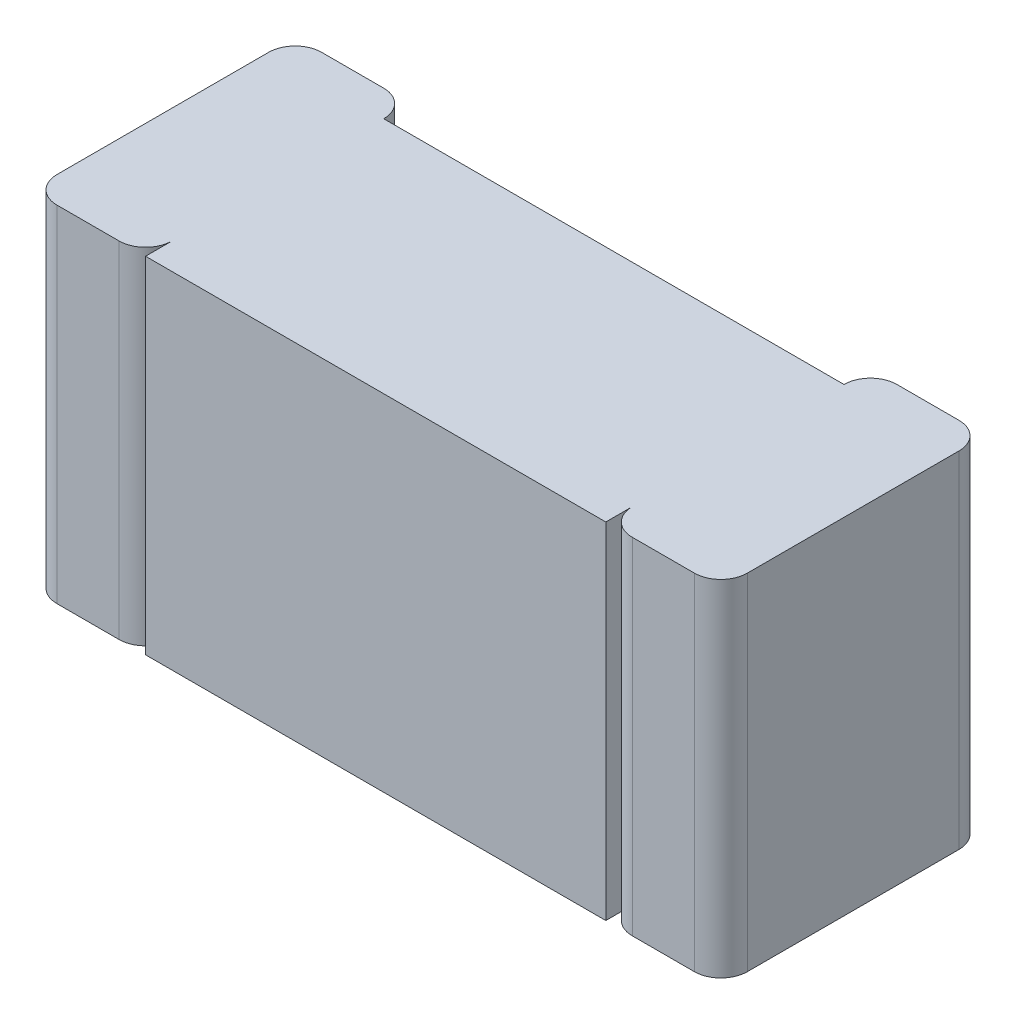
ISO-10303-21;
HEADER;
FILE_DESCRIPTION(('STEP AP214'),'2;1');
FILE_NAME('part.step','',(''),(''),'','','');
FILE_SCHEMA(('AUTOMOTIVE_DESIGN { 1 0 10303 214 1 1 1 1 }'));
ENDSEC;
DATA;
#1=APPLICATION_CONTEXT('core data for automotive mechanical design processes');
#2=APPLICATION_PROTOCOL_DEFINITION('international standard','automotive_design',2000,#1);
#3=PRODUCT_CONTEXT('',#1,'mechanical');
#4=PRODUCT('Part','Part','',(#3));
#5=PRODUCT_RELATED_PRODUCT_CATEGORY('part','',(#4));
#6=PRODUCT_DEFINITION_FORMATION('','',#4);
#7=PRODUCT_DEFINITION_CONTEXT('part definition',#1,'design');
#8=PRODUCT_DEFINITION('design','',#6,#7);
#9=PRODUCT_DEFINITION_SHAPE('','',#8);
#10=(LENGTH_UNIT() NAMED_UNIT(*) SI_UNIT(.MILLI.,.METRE.));
#11=(NAMED_UNIT(*) PLANE_ANGLE_UNIT() SI_UNIT($,.RADIAN.));
#12=(NAMED_UNIT(*) SI_UNIT($,.STERADIAN.) SOLID_ANGLE_UNIT());
#13=UNCERTAINTY_MEASURE_WITH_UNIT(LENGTH_MEASURE(1.E-05),#10,'distance_accuracy_value','');
#14=(GEOMETRIC_REPRESENTATION_CONTEXT(3) GLOBAL_UNCERTAINTY_ASSIGNED_CONTEXT((#13)) GLOBAL_UNIT_ASSIGNED_CONTEXT((#10,
#11,#12)) REPRESENTATION_CONTEXT('',''));
#15=CARTESIAN_POINT('',(0.,0.,0.));
#16=DIRECTION('',(0.,0.,1.));
#17=DIRECTION('',(1.,0.,0.));
#18=AXIS2_PLACEMENT_3D('',#15,#16,#17);
#19=CARTESIAN_POINT('',(-0.277,-0.15,0.023));
#20=DIRECTION('',(0.,1.,0.));
#21=DIRECTION('',(0.,0.,1.));
#22=AXIS2_PLACEMENT_3D('',#19,#20,#21);
#23=CYLINDRICAL_SURFACE('',#22,0.0230000000000008);
#24=DIRECTION('',(0.,-1.,0.));
#25=VECTOR('',#24,1.);
#26=CARTESIAN_POINT('',(-0.277,0.,0.));
#27=LINE('',#26,#25);
#28=CARTESIAN_POINT('',(-0.277,0.15,0.));
#29=VERTEX_POINT('',#28);
#30=CARTESIAN_POINT('',(-0.277,-0.15,0.));
#31=VERTEX_POINT('',#30);
#32=EDGE_CURVE('E127',#29,#31,#27,.T.);
#33=ORIENTED_EDGE('',*,*,#32,.T.);
#34=CARTESIAN_POINT('',(-0.277,-0.15,0.023));
#35=DIRECTION('',(0.,1.,0.));
#36=DIRECTION('',(0.,0.,1.));
#37=AXIS2_PLACEMENT_3D('',#34,#35,#36);
#38=CIRCLE('',#37,0.0230000000000008);
#39=CARTESIAN_POINT('',(-0.3,-0.15,0.023));
#40=VERTEX_POINT('',#39);
#41=EDGE_CURVE('E20',#31,#40,#38,.T.);
#42=ORIENTED_EDGE('',*,*,#41,.T.);
#43=DIRECTION('',(0.,1.,0.));
#44=VECTOR('',#43,1.);
#45=CARTESIAN_POINT('',(-0.3,0.,0.023));
#46=LINE('',#45,#44);
#47=CARTESIAN_POINT('',(-0.3,0.15,0.023));
#48=VERTEX_POINT('',#47);
#49=EDGE_CURVE('E137',#40,#48,#46,.T.);
#50=ORIENTED_EDGE('',*,*,#49,.T.);
#51=CARTESIAN_POINT('',(-0.277,0.15,0.023));
#52=DIRECTION('',(0.,1.,0.));
#53=DIRECTION('',(0.,0.,1.));
#54=AXIS2_PLACEMENT_3D('',#51,#52,#53);
#55=CIRCLE('',#54,0.0230000000000008);
#56=EDGE_CURVE('E235',#29,#48,#55,.T.);
#57=ORIENTED_EDGE('',*,*,#56,.F.);
#58=EDGE_LOOP('',(#33,#42,#50,#57));
#59=FACE_BOUND('',#58,.T.);
#60=ADVANCED_FACE('F16',(#59),#23,.T.);
#61=CARTESIAN_POINT('',(-0.3,0.15,0.023));
#62=DIRECTION('',(1.,0.,0.));
#63=DIRECTION('',(0.,0.,1.));
#64=AXIS2_PLACEMENT_3D('',#61,#62,#63);
#65=PLANE('',#64);
#66=DIRECTION('',(0.,0.,1.));
#67=VECTOR('',#66,1.);
#68=CARTESIAN_POINT('',(-0.3,0.15,0.115));
#69=LINE('',#68,#67);
#70=CARTESIAN_POINT('',(-0.3,0.15,0.207));
#71=VERTEX_POINT('',#70);
#72=EDGE_CURVE('E143',#48,#71,#69,.T.);
#73=ORIENTED_EDGE('',*,*,#72,.F.);
#74=ORIENTED_EDGE('',*,*,#49,.F.);
#75=DIRECTION('',(0.,0.,1.));
#76=VECTOR('',#75,1.);
#77=CARTESIAN_POINT('',(-0.3,-0.15,0.115));
#78=LINE('',#77,#76);
#79=CARTESIAN_POINT('',(-0.3,-0.15,0.207));
#80=VERTEX_POINT('',#79);
#81=EDGE_CURVE('E138',#40,#80,#78,.T.);
#82=ORIENTED_EDGE('',*,*,#81,.T.);
#83=DIRECTION('',(0.,-1.,0.));
#84=VECTOR('',#83,1.);
#85=CARTESIAN_POINT('',(-0.3,0.,0.207));
#86=LINE('',#85,#84);
#87=EDGE_CURVE('E142',#71,#80,#86,.T.);
#88=ORIENTED_EDGE('',*,*,#87,.F.);
#89=EDGE_LOOP('',(#73,#74,#82,#88));
#90=FACE_BOUND('',#89,.T.);
#91=ADVANCED_FACE('F139',(#90),#65,.F.);
#92=CARTESIAN_POINT('',(-0.277,-0.15,0.207));
#93=DIRECTION('',(0.,1.,0.));
#94=DIRECTION('',(0.,0.,1.));
#95=AXIS2_PLACEMENT_3D('',#92,#93,#94);
#96=CYLINDRICAL_SURFACE('',#95,0.0230000000000008);
#97=CARTESIAN_POINT('',(-0.277,0.15,0.207));
#98=DIRECTION('',(0.,1.,0.));
#99=DIRECTION('',(0.,0.,1.));
#100=AXIS2_PLACEMENT_3D('',#97,#98,#99);
#101=CIRCLE('',#100,0.0230000000000008);
#102=CARTESIAN_POINT('',(-0.277,0.15,0.23));
#103=VERTEX_POINT('',#102);
#104=EDGE_CURVE('E230',#71,#103,#101,.T.);
#105=ORIENTED_EDGE('',*,*,#104,.F.);
#106=ORIENTED_EDGE('',*,*,#87,.T.);
#107=CARTESIAN_POINT('',(-0.277,-0.15,0.207));
#108=DIRECTION('',(0.,1.,0.));
#109=DIRECTION('',(0.,0.,1.));
#110=AXIS2_PLACEMENT_3D('',#107,#108,#109);
#111=CIRCLE('',#110,0.0230000000000008);
#112=CARTESIAN_POINT('',(-0.277,-0.15,0.23));
#113=VERTEX_POINT('',#112);
#114=EDGE_CURVE('E151',#80,#113,#111,.T.);
#115=ORIENTED_EDGE('',*,*,#114,.T.);
#116=DIRECTION('',(0.,-1.,0.));
#117=VECTOR('',#116,1.);
#118=CARTESIAN_POINT('',(-0.277,0.,0.23));
#119=LINE('',#118,#117);
#120=EDGE_CURVE('E199',#103,#113,#119,.T.);
#121=ORIENTED_EDGE('',*,*,#120,.F.);
#122=EDGE_LOOP('',(#105,#106,#115,#121));
#123=FACE_BOUND('',#122,.T.);
#124=ADVANCED_FACE('F478',(#123),#96,.T.);
#125=CARTESIAN_POINT('',(-0.277,-0.15,0.23));
#126=DIRECTION('',(0.,0.,1.));
#127=DIRECTION('',(1.,0.,0.));
#128=AXIS2_PLACEMENT_3D('',#125,#126,#127);
#129=PLANE('',#128);
#130=DIRECTION('',(1.,0.,0.));
#131=VECTOR('',#130,1.);
#132=CARTESIAN_POINT('',(-0.25,-0.15,0.23));
#133=LINE('',#132,#131);
#134=CARTESIAN_POINT('',(-0.223,-0.15,0.23));
#135=VERTEX_POINT('',#134);
#136=EDGE_CURVE('E249',#113,#135,#133,.T.);
#137=ORIENTED_EDGE('',*,*,#136,.T.);
#138=DIRECTION('',(0.,-1.,0.));
#139=VECTOR('',#138,1.);
#140=CARTESIAN_POINT('',(-0.223,0.,0.23));
#141=LINE('',#140,#139);
#142=CARTESIAN_POINT('',(-0.223,0.15,0.23));
#143=VERTEX_POINT('',#142);
#144=EDGE_CURVE('E196',#143,#135,#141,.T.);
#145=ORIENTED_EDGE('',*,*,#144,.F.);
#146=DIRECTION('',(1.,0.,0.));
#147=VECTOR('',#146,1.);
#148=CARTESIAN_POINT('',(-0.25,0.15,0.23));
#149=LINE('',#148,#147);
#150=EDGE_CURVE('E228',#103,#143,#149,.T.);
#151=ORIENTED_EDGE('',*,*,#150,.F.);
#152=ORIENTED_EDGE('',*,*,#120,.T.);
#153=EDGE_LOOP('',(#137,#145,#151,#152));
#154=FACE_BOUND('',#153,.T.);
#155=ADVANCED_FACE('F467',(#154),#129,.T.);
#156=CARTESIAN_POINT('',(-0.223,-0.15,0.207));
#157=DIRECTION('',(0.,1.,0.));
#158=DIRECTION('',(0.,0.,1.));
#159=AXIS2_PLACEMENT_3D('',#156,#157,#158);
#160=CYLINDRICAL_SURFACE('',#159,0.0230000000000009);
#161=ORIENTED_EDGE('',*,*,#144,.T.);
#162=CARTESIAN_POINT('',(-0.223,-0.15,0.207));
#163=DIRECTION('',(0.,1.,0.));
#164=DIRECTION('',(0.,0.,1.));
#165=AXIS2_PLACEMENT_3D('',#162,#163,#164);
#166=CIRCLE('',#165,0.0230000000000009);
#167=CARTESIAN_POINT('',(-0.2,-0.15,0.207));
#168=VERTEX_POINT('',#167);
#169=EDGE_CURVE('E247',#135,#168,#166,.T.);
#170=ORIENTED_EDGE('',*,*,#169,.T.);
#171=DIRECTION('',(0.,1.,0.));
#172=VECTOR('',#171,1.);
#173=CARTESIAN_POINT('',(-0.2,0.,0.207));
#174=LINE('',#173,#172);
#175=CARTESIAN_POINT('',(-0.2,0.15,0.207));
#176=VERTEX_POINT('',#175);
#177=EDGE_CURVE('E194',#168,#176,#174,.T.);
#178=ORIENTED_EDGE('',*,*,#177,.T.);
#179=CARTESIAN_POINT('',(-0.223,0.15,0.207));
#180=DIRECTION('',(0.,1.,0.));
#181=DIRECTION('',(0.,0.,1.));
#182=AXIS2_PLACEMENT_3D('',#179,#180,#181);
#183=CIRCLE('',#182,0.0230000000000009);
#184=EDGE_CURVE('E227',#143,#176,#183,.T.);
#185=ORIENTED_EDGE('',*,*,#184,.F.);
#186=EDGE_LOOP('',(#161,#170,#178,#185));
#187=FACE_BOUND('',#186,.T.);
#188=ADVANCED_FACE('F453',(#187),#160,.T.);
#189=CARTESIAN_POINT('',(-0.2,0.15,0.207));
#190=DIRECTION('',(1.,0.,0.));
#191=DIRECTION('',(0.,0.,1.));
#192=AXIS2_PLACEMENT_3D('',#189,#190,#191);
#193=PLANE('',#192);
#194=DIRECTION('',(0.,0.,1.));
#195=VECTOR('',#194,1.);
#196=CARTESIAN_POINT('',(-0.2,0.15,0.2185));
#197=LINE('',#196,#195);
#198=CARTESIAN_POINT('',(-0.2,0.15,0.23));
#199=VERTEX_POINT('',#198);
#200=EDGE_CURVE('E187',#176,#199,#197,.T.);
#201=ORIENTED_EDGE('',*,*,#200,.F.);
#202=ORIENTED_EDGE('',*,*,#177,.F.);
#203=DIRECTION('',(0.,0.,1.));
#204=VECTOR('',#203,1.);
#205=CARTESIAN_POINT('',(-0.2,-0.15,0.2185));
#206=LINE('',#205,#204);
#207=CARTESIAN_POINT('',(-0.2,-0.15,0.23));
#208=VERTEX_POINT('',#207);
#209=EDGE_CURVE('E206',#168,#208,#206,.T.);
#210=ORIENTED_EDGE('',*,*,#209,.T.);
#211=DIRECTION('',(0.,-1.,0.));
#212=VECTOR('',#211,1.);
#213=CARTESIAN_POINT('',(-0.2,0.,0.23));
#214=LINE('',#213,#212);
#215=EDGE_CURVE('E185',#199,#208,#214,.T.);
#216=ORIENTED_EDGE('',*,*,#215,.F.);
#217=EDGE_LOOP('',(#201,#202,#210,#216));
#218=FACE_BOUND('',#217,.T.);
#219=ADVANCED_FACE('F445',(#218),#193,.F.);
#220=CARTESIAN_POINT('',(-0.2,-0.15,0.23));
#221=DIRECTION('',(0.,0.,1.));
#222=DIRECTION('',(1.,0.,0.));
#223=AXIS2_PLACEMENT_3D('',#220,#221,#222);
#224=PLANE('',#223);
#225=DIRECTION('',(0.,-1.,0.));
#226=VECTOR('',#225,1.);
#227=CARTESIAN_POINT('',(0.2,0.,0.23));
#228=LINE('',#227,#226);
#229=CARTESIAN_POINT('',(0.2,0.15,0.23));
#230=VERTEX_POINT('',#229);
#231=CARTESIAN_POINT('',(0.2,-0.15,0.23));
#232=VERTEX_POINT('',#231);
#233=EDGE_CURVE('E173',#230,#232,#228,.T.);
#234=ORIENTED_EDGE('',*,*,#233,.F.);
#235=DIRECTION('',(1.,0.,0.));
#236=VECTOR('',#235,1.);
#237=CARTESIAN_POINT('',(0.,0.15,0.23));
#238=LINE('',#237,#236);
#239=EDGE_CURVE('E182',#199,#230,#238,.T.);
#240=ORIENTED_EDGE('',*,*,#239,.F.);
#241=ORIENTED_EDGE('',*,*,#215,.T.);
#242=DIRECTION('',(1.,0.,0.));
#243=VECTOR('',#242,1.);
#244=CARTESIAN_POINT('',(0.,-0.15,0.23));
#245=LINE('',#244,#243);
#246=EDGE_CURVE('E201',#208,#232,#245,.T.);
#247=ORIENTED_EDGE('',*,*,#246,.T.);
#248=EDGE_LOOP('',(#234,#240,#241,#247));
#249=FACE_BOUND('',#248,.T.);
#250=ADVANCED_FACE('F428',(#249),#224,.T.);
#251=CARTESIAN_POINT('',(0.2,0.15,0.207));
#252=DIRECTION('',(1.,0.,0.));
#253=DIRECTION('',(0.,0.,1.));
#254=AXIS2_PLACEMENT_3D('',#251,#252,#253);
#255=PLANE('',#254);
#256=DIRECTION('',(0.,0.,-1.));
#257=VECTOR('',#256,1.);
#258=CARTESIAN_POINT('',(0.2,0.15,0.2185));
#259=LINE('',#258,#257);
#260=CARTESIAN_POINT('',(0.2,0.15,0.207));
#261=VERTEX_POINT('',#260);
#262=EDGE_CURVE('E190',#230,#261,#259,.T.);
#263=ORIENTED_EDGE('',*,*,#262,.F.);
#264=ORIENTED_EDGE('',*,*,#233,.T.);
#265=DIRECTION('',(0.,0.,-1.));
#266=VECTOR('',#265,1.);
#267=CARTESIAN_POINT('',(0.2,-0.15,0.2185));
#268=LINE('',#267,#266);
#269=CARTESIAN_POINT('',(0.2,-0.15,0.207));
#270=VERTEX_POINT('',#269);
#271=EDGE_CURVE('E178',#232,#270,#268,.T.);
#272=ORIENTED_EDGE('',*,*,#271,.T.);
#273=DIRECTION('',(0.,-1.,0.));
#274=VECTOR('',#273,1.);
#275=CARTESIAN_POINT('',(0.2,0.,0.207));
#276=LINE('',#275,#274);
#277=EDGE_CURVE('E172',#261,#270,#276,.T.);
#278=ORIENTED_EDGE('',*,*,#277,.F.);
#279=EDGE_LOOP('',(#263,#264,#272,#278));
#280=FACE_BOUND('',#279,.T.);
#281=ADVANCED_FACE('F379',(#280),#255,.T.);
#282=CARTESIAN_POINT('',(0.223,-0.15,0.207));
#283=DIRECTION('',(0.,1.,0.));
#284=DIRECTION('',(0.,0.,1.));
#285=AXIS2_PLACEMENT_3D('',#282,#283,#284);
#286=CYLINDRICAL_SURFACE('',#285,0.0230000000000009);
#287=CARTESIAN_POINT('',(0.223,0.15,0.207));
#288=DIRECTION('',(0.,1.,0.));
#289=DIRECTION('',(0.,0.,1.));
#290=AXIS2_PLACEMENT_3D('',#287,#288,#289);
#291=CIRCLE('',#290,0.0230000000000009);
#292=CARTESIAN_POINT('',(0.223,0.15,0.23));
#293=VERTEX_POINT('',#292);
#294=EDGE_CURVE('E221',#261,#293,#291,.T.);
#295=ORIENTED_EDGE('',*,*,#294,.F.);
#296=ORIENTED_EDGE('',*,*,#277,.T.);
#297=CARTESIAN_POINT('',(0.223,-0.15,0.207));
#298=DIRECTION('',(0.,1.,0.));
#299=DIRECTION('',(0.,0.,1.));
#300=AXIS2_PLACEMENT_3D('',#297,#298,#299);
#301=CIRCLE('',#300,0.0230000000000009);
#302=CARTESIAN_POINT('',(0.223,-0.15,0.23));
#303=VERTEX_POINT('',#302);
#304=EDGE_CURVE('E242',#270,#303,#301,.T.);
#305=ORIENTED_EDGE('',*,*,#304,.T.);
#306=DIRECTION('',(0.,-1.,0.));
#307=VECTOR('',#306,1.);
#308=CARTESIAN_POINT('',(0.223,0.,0.23));
#309=LINE('',#308,#307);
#310=EDGE_CURVE('E168',#293,#303,#309,.T.);
#311=ORIENTED_EDGE('',*,*,#310,.F.);
#312=EDGE_LOOP('',(#295,#296,#305,#311));
#313=FACE_BOUND('',#312,.T.);
#314=ADVANCED_FACE('F430',(#313),#286,.T.);
#315=CARTESIAN_POINT('',(0.223,-0.15,0.23));
#316=DIRECTION('',(0.,0.,1.));
#317=DIRECTION('',(1.,0.,0.));
#318=AXIS2_PLACEMENT_3D('',#315,#316,#317);
#319=PLANE('',#318);
#320=DIRECTION('',(1.,0.,0.));
#321=VECTOR('',#320,1.);
#322=CARTESIAN_POINT('',(0.25,-0.15,0.23));
#323=LINE('',#322,#321);
#324=CARTESIAN_POINT('',(0.277,-0.15,0.23));
#325=VERTEX_POINT('',#324);
#326=EDGE_CURVE('E245',#303,#325,#323,.T.);
#327=ORIENTED_EDGE('',*,*,#326,.T.);
#328=DIRECTION('',(0.,-1.,0.));
#329=VECTOR('',#328,1.);
#330=CARTESIAN_POINT('',(0.277,0.,0.23));
#331=LINE('',#330,#329);
#332=CARTESIAN_POINT('',(0.277,0.15,0.23));
#333=VERTEX_POINT('',#332);
#334=EDGE_CURVE('E169',#333,#325,#331,.T.);
#335=ORIENTED_EDGE('',*,*,#334,.F.);
#336=DIRECTION('',(1.,0.,0.));
#337=VECTOR('',#336,1.);
#338=CARTESIAN_POINT('',(0.25,0.15,0.23));
#339=LINE('',#338,#337);
#340=EDGE_CURVE('E224',#293,#333,#339,.T.);
#341=ORIENTED_EDGE('',*,*,#340,.F.);
#342=ORIENTED_EDGE('',*,*,#310,.T.);
#343=EDGE_LOOP('',(#327,#335,#341,#342));
#344=FACE_BOUND('',#343,.T.);
#345=ADVANCED_FACE('F507',(#344),#319,.T.);
#346=CARTESIAN_POINT('',(0.277,-0.15,0.207));
#347=DIRECTION('',(0.,1.,0.));
#348=DIRECTION('',(0.,0.,1.));
#349=AXIS2_PLACEMENT_3D('',#346,#347,#348);
#350=CYLINDRICAL_SURFACE('',#349,0.0230000000000009);
#351=ORIENTED_EDGE('',*,*,#334,.T.);
#352=CARTESIAN_POINT('',(0.277,-0.15,0.207));
#353=DIRECTION('',(0.,1.,0.));
#354=DIRECTION('',(0.,0.,1.));
#355=AXIS2_PLACEMENT_3D('',#352,#353,#354);
#356=CIRCLE('',#355,0.0230000000000009);
#357=CARTESIAN_POINT('',(0.3,-0.15,0.207));
#358=VERTEX_POINT('',#357);
#359=EDGE_CURVE('E237',#325,#358,#356,.T.);
#360=ORIENTED_EDGE('',*,*,#359,.T.);
#361=DIRECTION('',(0.,-1.,0.));
#362=VECTOR('',#361,1.);
#363=CARTESIAN_POINT('',(0.3,0.,0.207));
#364=LINE('',#363,#362);
#365=CARTESIAN_POINT('',(0.3,0.15,0.207));
#366=VERTEX_POINT('',#365);
#367=EDGE_CURVE('E167',#366,#358,#364,.T.);
#368=ORIENTED_EDGE('',*,*,#367,.F.);
#369=CARTESIAN_POINT('',(0.277,0.15,0.207));
#370=DIRECTION('',(0.,1.,0.));
#371=DIRECTION('',(0.,0.,1.));
#372=AXIS2_PLACEMENT_3D('',#369,#370,#371);
#373=CIRCLE('',#372,0.0230000000000009);
#374=EDGE_CURVE('E222',#333,#366,#373,.T.);
#375=ORIENTED_EDGE('',*,*,#374,.F.);
#376=EDGE_LOOP('',(#351,#360,#368,#375));
#377=FACE_BOUND('',#376,.T.);
#378=ADVANCED_FACE('F513',(#377),#350,.T.);
#379=CARTESIAN_POINT('',(0.3,0.15,0.023));
#380=DIRECTION('',(1.,0.,0.));
#381=DIRECTION('',(0.,0.,1.));
#382=AXIS2_PLACEMENT_3D('',#379,#380,#381);
#383=PLANE('',#382);
#384=DIRECTION('',(0.,0.,-1.));
#385=VECTOR('',#384,1.);
#386=CARTESIAN_POINT('',(0.3,0.15,0.115));
#387=LINE('',#386,#385);
#388=CARTESIAN_POINT('',(0.3,0.15,0.023));
#389=VERTEX_POINT('',#388);
#390=EDGE_CURVE('E219',#366,#389,#387,.T.);
#391=ORIENTED_EDGE('',*,*,#390,.F.);
#392=ORIENTED_EDGE('',*,*,#367,.T.);
#393=DIRECTION('',(0.,0.,-1.));
#394=VECTOR('',#393,1.);
#395=CARTESIAN_POINT('',(0.3,-0.15,0.115));
#396=LINE('',#395,#394);
#397=CARTESIAN_POINT('',(0.3,-0.15,0.023));
#398=VERTEX_POINT('',#397);
#399=EDGE_CURVE('E238',#358,#398,#396,.T.);
#400=ORIENTED_EDGE('',*,*,#399,.T.);
#401=DIRECTION('',(0.,-1.,0.));
#402=VECTOR('',#401,1.);
#403=CARTESIAN_POINT('',(0.3,0.,0.023));
#404=LINE('',#403,#402);
#405=EDGE_CURVE('E160',#389,#398,#404,.T.);
#406=ORIENTED_EDGE('',*,*,#405,.F.);
#407=EDGE_LOOP('',(#391,#392,#400,#406));
#408=FACE_BOUND('',#407,.T.);
#409=ADVANCED_FACE('F297',(#408),#383,.T.);
#410=CARTESIAN_POINT('',(0.277,-0.15,0.023));
#411=DIRECTION('',(0.,1.,0.));
#412=DIRECTION('',(0.,0.,1.));
#413=AXIS2_PLACEMENT_3D('',#410,#411,#412);
#414=CYLINDRICAL_SURFACE('',#413,0.0230000000000008);
#415=CARTESIAN_POINT('',(0.277,0.15,0.023));
#416=DIRECTION('',(0.,1.,0.));
#417=DIRECTION('',(0.,0.,1.));
#418=AXIS2_PLACEMENT_3D('',#415,#416,#417);
#419=CIRCLE('',#418,0.0230000000000008);
#420=CARTESIAN_POINT('',(0.277,0.15,0.));
#421=VERTEX_POINT('',#420);
#422=EDGE_CURVE('E220',#389,#421,#419,.T.);
#423=ORIENTED_EDGE('',*,*,#422,.F.);
#424=ORIENTED_EDGE('',*,*,#405,.T.);
#425=CARTESIAN_POINT('',(0.277,-0.15,0.023));
#426=DIRECTION('',(0.,1.,0.));
#427=DIRECTION('',(0.,0.,1.));
#428=AXIS2_PLACEMENT_3D('',#425,#426,#427);
#429=CIRCLE('',#428,0.0230000000000008);
#430=CARTESIAN_POINT('',(0.277,-0.15,0.));
#431=VERTEX_POINT('',#430);
#432=EDGE_CURVE('E234',#398,#431,#429,.T.);
#433=ORIENTED_EDGE('',*,*,#432,.T.);
#434=DIRECTION('',(0.,1.,0.));
#435=VECTOR('',#434,1.);
#436=CARTESIAN_POINT('',(0.277,0.,0.));
#437=LINE('',#436,#435);
#438=EDGE_CURVE('E175',#431,#421,#437,.T.);
#439=ORIENTED_EDGE('',*,*,#438,.T.);
#440=EDGE_LOOP('',(#423,#424,#433,#439));
#441=FACE_BOUND('',#440,.T.);
#442=ADVANCED_FACE('F305',(#441),#414,.T.);
#443=CARTESIAN_POINT('',(-0.277,-0.15,0.));
#444=DIRECTION('',(0.,0.,1.));
#445=DIRECTION('',(1.,0.,0.));
#446=AXIS2_PLACEMENT_3D('',#443,#444,#445);
#447=PLANE('',#446);
#448=DIRECTION('',(-1.,0.,0.));
#449=VECTOR('',#448,1.);
#450=CARTESIAN_POINT('',(-0.25,-0.15,0.));
#451=LINE('',#450,#449);
#452=CARTESIAN_POINT('',(-0.223,-0.15,0.));
#453=VERTEX_POINT('',#452);
#454=EDGE_CURVE('E153',#453,#31,#451,.T.);
#455=ORIENTED_EDGE('',*,*,#454,.T.);
#456=ORIENTED_EDGE('',*,*,#32,.F.);
#457=DIRECTION('',(-1.,0.,0.));
#458=VECTOR('',#457,1.);
#459=CARTESIAN_POINT('',(-0.25,0.15,0.));
#460=LINE('',#459,#458);
#461=CARTESIAN_POINT('',(-0.223,0.15,0.));
#462=VERTEX_POINT('',#461);
#463=EDGE_CURVE('E232',#462,#29,#460,.T.);
#464=ORIENTED_EDGE('',*,*,#463,.F.);
#465=DIRECTION('',(0.,1.,0.));
#466=VECTOR('',#465,1.);
#467=CARTESIAN_POINT('',(-0.223,0.,0.));
#468=LINE('',#467,#466);
#469=EDGE_CURVE('E161',#453,#462,#468,.T.);
#470=ORIENTED_EDGE('',*,*,#469,.F.);
#471=EDGE_LOOP('',(#455,#456,#464,#470));
#472=FACE_BOUND('',#471,.T.);
#473=ADVANCED_FACE('F318',(#472),#447,.F.);
#474=CARTESIAN_POINT('',(0.223,-0.15,0.));
#475=DIRECTION('',(0.,0.,1.));
#476=DIRECTION('',(1.,0.,0.));
#477=AXIS2_PLACEMENT_3D('',#474,#475,#476);
#478=PLANE('',#477);
#479=DIRECTION('',(-1.,0.,0.));
#480=VECTOR('',#479,1.);
#481=CARTESIAN_POINT('',(0.25,-0.15,0.));
#482=LINE('',#481,#480);
#483=CARTESIAN_POINT('',(0.223,-0.15,0.));
#484=VERTEX_POINT('',#483);
#485=EDGE_CURVE('E180',#431,#484,#482,.T.);
#486=ORIENTED_EDGE('',*,*,#485,.T.);
#487=DIRECTION('',(0.,-1.,0.));
#488=VECTOR('',#487,1.);
#489=CARTESIAN_POINT('',(0.223,0.,0.));
#490=LINE('',#489,#488);
#491=CARTESIAN_POINT('',(0.223,0.15,0.));
#492=VERTEX_POINT('',#491);
#493=EDGE_CURVE('E215',#492,#484,#490,.T.);
#494=ORIENTED_EDGE('',*,*,#493,.F.);
#495=DIRECTION('',(-1.,0.,0.));
#496=VECTOR('',#495,1.);
#497=CARTESIAN_POINT('',(0.25,0.15,0.));
#498=LINE('',#497,#496);
#499=EDGE_CURVE('E226',#421,#492,#498,.T.);
#500=ORIENTED_EDGE('',*,*,#499,.F.);
#501=ORIENTED_EDGE('',*,*,#438,.F.);
#502=EDGE_LOOP('',(#486,#494,#500,#501));
#503=FACE_BOUND('',#502,.T.);
#504=ADVANCED_FACE('F303',(#503),#478,.F.);
#505=CARTESIAN_POINT('',(-0.223,-0.15,0.023));
#506=DIRECTION('',(0.,1.,0.));
#507=DIRECTION('',(0.,0.,1.));
#508=AXIS2_PLACEMENT_3D('',#505,#506,#507);
#509=CYLINDRICAL_SURFACE('',#508,0.0230000000000008);
#510=CARTESIAN_POINT('',(-0.223,0.15,0.023));
#511=DIRECTION('',(0.,1.,0.));
#512=DIRECTION('',(0.,0.,1.));
#513=AXIS2_PLACEMENT_3D('',#510,#511,#512);
#514=CIRCLE('',#513,0.0230000000000008);
#515=CARTESIAN_POINT('',(-0.2,0.15,0.023));
#516=VERTEX_POINT('',#515);
#517=EDGE_CURVE('E162',#462,#516,#514,.F.);
#518=ORIENTED_EDGE('',*,*,#517,.T.);
#519=DIRECTION('',(0.,-1.,0.));
#520=VECTOR('',#519,1.);
#521=CARTESIAN_POINT('',(-0.2,0.,0.023));
#522=LINE('',#521,#520);
#523=CARTESIAN_POINT('',(-0.2,-0.15,0.023));
#524=VERTEX_POINT('',#523);
#525=EDGE_CURVE('E211',#516,#524,#522,.T.);
#526=ORIENTED_EDGE('',*,*,#525,.T.);
#527=CARTESIAN_POINT('',(-0.223,-0.15,0.023));
#528=DIRECTION('',(0.,1.,0.));
#529=DIRECTION('',(0.,0.,1.));
#530=AXIS2_PLACEMENT_3D('',#527,#528,#529);
#531=CIRCLE('',#530,0.0230000000000008);
#532=EDGE_CURVE('E163',#524,#453,#531,.T.);
#533=ORIENTED_EDGE('',*,*,#532,.T.);
#534=ORIENTED_EDGE('',*,*,#469,.T.);
#535=EDGE_LOOP('',(#518,#526,#533,#534));
#536=FACE_BOUND('',#535,.T.);
#537=ADVANCED_FACE('F320',(#536),#509,.T.);
#538=CARTESIAN_POINT('',(-0.277,-0.15,0.023));
#539=DIRECTION('',(0.,1.,0.));
#540=DIRECTION('',(0.,0.,1.));
#541=AXIS2_PLACEMENT_3D('',#538,#539,#540);
#542=PLANE('',#541);
#543=DIRECTION('',(1.,0.,0.));
#544=VECTOR('',#543,1.);
#545=CARTESIAN_POINT('',(0.,-0.15,0.023));
#546=LINE('',#545,#544);
#547=CARTESIAN_POINT('',(0.2,-0.15,0.023));
#548=VERTEX_POINT('',#547);
#549=EDGE_CURVE('E263',#524,#548,#546,.T.);
#550=ORIENTED_EDGE('',*,*,#549,.T.);
#551=CARTESIAN_POINT('',(0.223,-0.15,0.023));
#552=DIRECTION('',(0.,1.,0.));
#553=DIRECTION('',(0.,0.,1.));
#554=AXIS2_PLACEMENT_3D('',#551,#552,#553);
#555=CIRCLE('',#554,0.0230000000000008);
#556=EDGE_CURVE('E207',#484,#548,#555,.T.);
#557=ORIENTED_EDGE('',*,*,#556,.F.);
#558=ORIENTED_EDGE('',*,*,#485,.F.);
#559=ORIENTED_EDGE('',*,*,#432,.F.);
#560=ORIENTED_EDGE('',*,*,#399,.F.);
#561=ORIENTED_EDGE('',*,*,#359,.F.);
#562=ORIENTED_EDGE('',*,*,#326,.F.);
#563=ORIENTED_EDGE('',*,*,#304,.F.);
#564=ORIENTED_EDGE('',*,*,#271,.F.);
#565=ORIENTED_EDGE('',*,*,#246,.F.);
#566=ORIENTED_EDGE('',*,*,#209,.F.);
#567=ORIENTED_EDGE('',*,*,#169,.F.);
#568=ORIENTED_EDGE('',*,*,#136,.F.);
#569=ORIENTED_EDGE('',*,*,#114,.F.);
#570=ORIENTED_EDGE('',*,*,#81,.F.);
#571=ORIENTED_EDGE('',*,*,#41,.F.);
#572=ORIENTED_EDGE('',*,*,#454,.F.);
#573=ORIENTED_EDGE('',*,*,#532,.F.);
#574=EDGE_LOOP('',(#550,#557,#558,#559,#560,#561,#562,#563,#564,#565,#566,#567,#568,#569,#570,
#571,#572,#573));
#575=FACE_BOUND('',#574,.T.);
#576=ADVANCED_FACE('F150',(#575),#542,.F.);
#577=CARTESIAN_POINT('',(0.223,-0.15,0.023));
#578=DIRECTION('',(0.,1.,0.));
#579=DIRECTION('',(0.,0.,1.));
#580=AXIS2_PLACEMENT_3D('',#577,#578,#579);
#581=CYLINDRICAL_SURFACE('',#580,0.0230000000000008);
#582=ORIENTED_EDGE('',*,*,#493,.T.);
#583=ORIENTED_EDGE('',*,*,#556,.T.);
#584=DIRECTION('',(0.,1.,0.));
#585=VECTOR('',#584,1.);
#586=CARTESIAN_POINT('',(0.2,0.,0.023));
#587=LINE('',#586,#585);
#588=CARTESIAN_POINT('',(0.2,0.15,0.023));
#589=VERTEX_POINT('',#588);
#590=EDGE_CURVE('E27',#548,#589,#587,.T.);
#591=ORIENTED_EDGE('',*,*,#590,.T.);
#592=CARTESIAN_POINT('',(0.223,0.15,0.023));
#593=DIRECTION('',(0.,1.,0.));
#594=DIRECTION('',(0.,0.,1.));
#595=AXIS2_PLACEMENT_3D('',#592,#593,#594);
#596=CIRCLE('',#595,0.0230000000000008);
#597=EDGE_CURVE('E35',#589,#492,#596,.F.);
#598=ORIENTED_EDGE('',*,*,#597,.T.);
#599=EDGE_LOOP('',(#582,#583,#591,#598));
#600=FACE_BOUND('',#599,.T.);
#601=ADVANCED_FACE('F313',(#600),#581,.T.);
#602=CARTESIAN_POINT('',(-0.277,0.15,0.023));
#603=DIRECTION('',(0.,1.,0.));
#604=DIRECTION('',(0.,0.,1.));
#605=AXIS2_PLACEMENT_3D('',#602,#603,#604);
#606=PLANE('',#605);
#607=DIRECTION('',(-1.,0.,0.));
#608=VECTOR('',#607,1.);
#609=CARTESIAN_POINT('',(0.,0.15,0.023));
#610=LINE('',#609,#608);
#611=EDGE_CURVE('E11',#589,#516,#610,.T.);
#612=ORIENTED_EDGE('',*,*,#611,.T.);
#613=ORIENTED_EDGE('',*,*,#517,.F.);
#614=ORIENTED_EDGE('',*,*,#463,.T.);
#615=ORIENTED_EDGE('',*,*,#56,.T.);
#616=ORIENTED_EDGE('',*,*,#72,.T.);
#617=ORIENTED_EDGE('',*,*,#104,.T.);
#618=ORIENTED_EDGE('',*,*,#150,.T.);
#619=ORIENTED_EDGE('',*,*,#184,.T.);
#620=ORIENTED_EDGE('',*,*,#200,.T.);
#621=ORIENTED_EDGE('',*,*,#239,.T.);
#622=ORIENTED_EDGE('',*,*,#262,.T.);
#623=ORIENTED_EDGE('',*,*,#294,.T.);
#624=ORIENTED_EDGE('',*,*,#340,.T.);
#625=ORIENTED_EDGE('',*,*,#374,.T.);
#626=ORIENTED_EDGE('',*,*,#390,.T.);
#627=ORIENTED_EDGE('',*,*,#422,.T.);
#628=ORIENTED_EDGE('',*,*,#499,.T.);
#629=ORIENTED_EDGE('',*,*,#597,.F.);
#630=EDGE_LOOP('',(#612,#613,#614,#615,#616,#617,#618,#619,#620,#621,#622,#623,#624,#625,#626,
#627,#628,#629));
#631=FACE_BOUND('',#630,.T.);
#632=ADVANCED_FACE('F291',(#631),#606,.T.);
#633=CARTESIAN_POINT('',(-0.2,-0.15,0.023));
#634=DIRECTION('',(0.,0.,1.));
#635=DIRECTION('',(1.,0.,0.));
#636=AXIS2_PLACEMENT_3D('',#633,#634,#635);
#637=PLANE('',#636);
#638=ORIENTED_EDGE('',*,*,#590,.F.);
#639=ORIENTED_EDGE('',*,*,#549,.F.);
#640=ORIENTED_EDGE('',*,*,#525,.F.);
#641=ORIENTED_EDGE('',*,*,#611,.F.);
#642=EDGE_LOOP('',(#638,#639,#640,#641));
#643=FACE_BOUND('',#642,.T.);
#644=ADVANCED_FACE('F18',(#643),#637,.F.);
#645=CLOSED_SHELL('',(#60,#91,#124,#155,#188,#219,#250,#281,#314,#345,#378,#409,#442,#473,#504,
#537,#576,#601,#632,#644));
#646=MANIFOLD_SOLID_BREP('B1',#645);
#647=ADVANCED_BREP_SHAPE_REPRESENTATION('',(#18,#646),#14);
#648=SHAPE_DEFINITION_REPRESENTATION(#9,#647);
ENDSEC;
END-ISO-10303-21;
